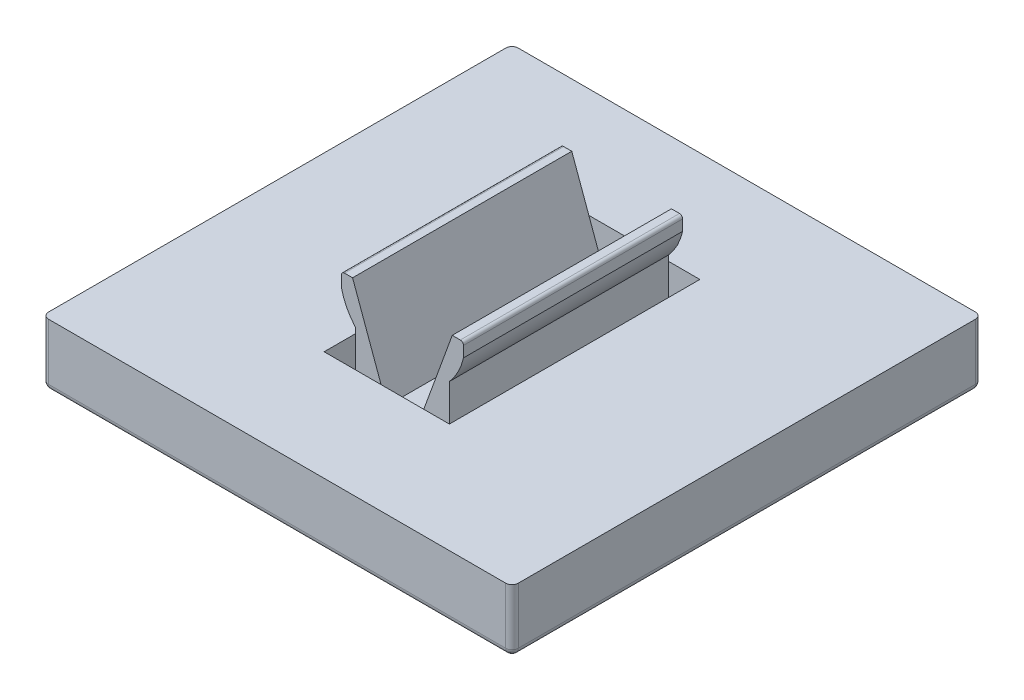
ISO-10303-21;
HEADER;
FILE_DESCRIPTION(('STEP AP214'),'2;1');
FILE_NAME('part.step','',(''),(''),'','','');
FILE_SCHEMA(('AUTOMOTIVE_DESIGN { 1 0 10303 214 1 1 1 1 }'));
ENDSEC;
DATA;
#1=APPLICATION_CONTEXT('core data for automotive mechanical design processes');
#2=APPLICATION_PROTOCOL_DEFINITION('international standard','automotive_design',2000,#1);
#3=PRODUCT_CONTEXT('',#1,'mechanical');
#4=PRODUCT('Part','Part','',(#3));
#5=PRODUCT_RELATED_PRODUCT_CATEGORY('part','',(#4));
#6=PRODUCT_DEFINITION_FORMATION('','',#4);
#7=PRODUCT_DEFINITION_CONTEXT('part definition',#1,'design');
#8=PRODUCT_DEFINITION('design','',#6,#7);
#9=PRODUCT_DEFINITION_SHAPE('','',#8);
#10=(LENGTH_UNIT() NAMED_UNIT(*) SI_UNIT(.MILLI.,.METRE.));
#11=(NAMED_UNIT(*) PLANE_ANGLE_UNIT() SI_UNIT($,.RADIAN.));
#12=(NAMED_UNIT(*) SI_UNIT($,.STERADIAN.) SOLID_ANGLE_UNIT());
#13=UNCERTAINTY_MEASURE_WITH_UNIT(LENGTH_MEASURE(1.E-05),#10,'distance_accuracy_value','');
#14=(GEOMETRIC_REPRESENTATION_CONTEXT(3) GLOBAL_UNCERTAINTY_ASSIGNED_CONTEXT((#13)) GLOBAL_UNIT_ASSIGNED_CONTEXT((#10,
#11,#12)) REPRESENTATION_CONTEXT('',''));
#15=CARTESIAN_POINT('',(0.,0.,0.));
#16=DIRECTION('',(0.,0.,1.));
#17=DIRECTION('',(1.,0.,0.));
#18=AXIS2_PLACEMENT_3D('',#15,#16,#17);
#19=CARTESIAN_POINT('',(0.,1.,0.));
#20=DIRECTION('',(0.,1.,0.));
#21=DIRECTION('',(0.,0.,1.));
#22=AXIS2_PLACEMENT_3D('',#19,#20,#21);
#23=PLANE('',#22);
#24=DIRECTION('',(1.,0.,0.));
#25=VECTOR('',#24,1.);
#26=CARTESIAN_POINT('',(0.5,1.,-3.5));
#27=LINE('',#26,#25);
#28=CARTESIAN_POINT('',(0.5,1.,-3.5));
#29=VERTEX_POINT('',#28);
#30=CARTESIAN_POINT('',(1.5,1.,-3.5));
#31=VERTEX_POINT('',#30);
#32=EDGE_CURVE('E264',#29,#31,#27,.T.);
#33=ORIENTED_EDGE('',*,*,#32,.T.);
#34=DIRECTION('',(0.,0.,1.));
#35=VECTOR('',#34,1.);
#36=CARTESIAN_POINT('',(1.5,1.,-3.5));
#37=LINE('',#36,#35);
#38=CARTESIAN_POINT('',(1.5,1.,3.5));
#39=VERTEX_POINT('',#38);
#40=EDGE_CURVE('E272',#31,#39,#37,.T.);
#41=ORIENTED_EDGE('',*,*,#40,.T.);
#42=DIRECTION('',(1.,0.,0.));
#43=VECTOR('',#42,1.);
#44=CARTESIAN_POINT('',(0.5,1.,3.5));
#45=LINE('',#44,#43);
#46=CARTESIAN_POINT('',(0.5,1.,3.5));
#47=VERTEX_POINT('',#46);
#48=EDGE_CURVE('E253',#47,#39,#45,.T.);
#49=ORIENTED_EDGE('',*,*,#48,.F.);
#50=DIRECTION('',(0.,0.,1.));
#51=VECTOR('',#50,1.);
#52=CARTESIAN_POINT('',(0.5,1.,-3.5));
#53=LINE('',#52,#51);
#54=EDGE_CURVE('E275',#29,#47,#53,.T.);
#55=ORIENTED_EDGE('',*,*,#54,.F.);
#56=EDGE_LOOP('',(#33,#41,#49,#55));
#57=FACE_BOUND('',#56,.T.);
#58=DIRECTION('',(-1.,0.,0.));
#59=VECTOR('',#58,1.);
#60=CARTESIAN_POINT('',(2.,1.,-4.));
#61=LINE('',#60,#59);
#62=CARTESIAN_POINT('',(2.,1.,-4.));
#63=VERTEX_POINT('',#62);
#64=CARTESIAN_POINT('',(-2.,1.,-4.));
#65=VERTEX_POINT('',#64);
#66=EDGE_CURVE('E325',#63,#65,#61,.T.);
#67=ORIENTED_EDGE('',*,*,#66,.T.);
#68=DIRECTION('',(0.,0.,1.));
#69=VECTOR('',#68,1.);
#70=CARTESIAN_POINT('',(-2.,1.,-4.));
#71=LINE('',#70,#69);
#72=CARTESIAN_POINT('',(-2.,1.,4.));
#73=VERTEX_POINT('',#72);
#74=EDGE_CURVE('E328',#65,#73,#71,.T.);
#75=ORIENTED_EDGE('',*,*,#74,.T.);
#76=DIRECTION('',(1.,0.,0.));
#77=VECTOR('',#76,1.);
#78=CARTESIAN_POINT('',(2.,1.,4.));
#79=LINE('',#78,#77);
#80=CARTESIAN_POINT('',(2.,1.,4.));
#81=VERTEX_POINT('',#80);
#82=EDGE_CURVE('E332',#73,#81,#79,.T.);
#83=ORIENTED_EDGE('',*,*,#82,.T.);
#84=DIRECTION('',(0.,0.,-1.));
#85=VECTOR('',#84,1.);
#86=CARTESIAN_POINT('',(2.,1.,-4.));
#87=LINE('',#86,#85);
#88=EDGE_CURVE('E335',#81,#63,#87,.T.);
#89=ORIENTED_EDGE('',*,*,#88,.T.);
#90=EDGE_LOOP('',(#67,#75,#83,#89));
#91=FACE_BOUND('',#90,.T.);
#92=DIRECTION('',(0.,0.,1.));
#93=VECTOR('',#92,1.);
#94=CARTESIAN_POINT('',(-1.5,1.,-3.5));
#95=LINE('',#94,#93);
#96=CARTESIAN_POINT('',(-1.5,1.,-3.5));
#97=VERTEX_POINT('',#96);
#98=CARTESIAN_POINT('',(-1.5,1.,3.5));
#99=VERTEX_POINT('',#98);
#100=EDGE_CURVE('E318',#97,#99,#95,.T.);
#101=ORIENTED_EDGE('',*,*,#100,.F.);
#102=DIRECTION('',(1.,0.,0.));
#103=VECTOR('',#102,1.);
#104=CARTESIAN_POINT('',(-0.5,1.,-3.5));
#105=LINE('',#104,#103);
#106=CARTESIAN_POINT('',(-0.5,1.,-3.5));
#107=VERTEX_POINT('',#106);
#108=EDGE_CURVE('E307',#97,#107,#105,.T.);
#109=ORIENTED_EDGE('',*,*,#108,.T.);
#110=DIRECTION('',(0.,0.,1.));
#111=VECTOR('',#110,1.);
#112=CARTESIAN_POINT('',(-0.5,1.,-3.5));
#113=LINE('',#112,#111);
#114=CARTESIAN_POINT('',(-0.5,1.,3.5));
#115=VERTEX_POINT('',#114);
#116=EDGE_CURVE('E316',#107,#115,#113,.T.);
#117=ORIENTED_EDGE('',*,*,#116,.T.);
#118=DIRECTION('',(1.,0.,0.));
#119=VECTOR('',#118,1.);
#120=CARTESIAN_POINT('',(-0.5,1.,3.5));
#121=LINE('',#120,#119);
#122=EDGE_CURVE('E290',#99,#115,#121,.T.);
#123=ORIENTED_EDGE('',*,*,#122,.F.);
#124=EDGE_LOOP('',(#101,#109,#117,#123));
#125=FACE_BOUND('',#124,.T.);
#126=ADVANCED_FACE('F34',(#57,#91,#125),#23,.T.);
#127=CARTESIAN_POINT('',(7.5,2.,-7.49999999999999));
#128=DIRECTION('',(0.,0.,1.));
#129=DIRECTION('',(1.,0.,0.));
#130=AXIS2_PLACEMENT_3D('',#127,#128,#129);
#131=PLANE('',#130);
#132=DIRECTION('',(-1.,0.,0.));
#133=VECTOR('',#132,1.);
#134=CARTESIAN_POINT('',(7.5,0.2,-7.49999999999999));
#135=LINE('',#134,#133);
#136=CARTESIAN_POINT('',(7.3,0.2,-7.49999999999999));
#137=VERTEX_POINT('',#136);
#138=CARTESIAN_POINT('',(-7.3,0.2,-7.49999999999999));
#139=VERTEX_POINT('',#138);
#140=EDGE_CURVE('E51',#137,#139,#135,.T.);
#141=ORIENTED_EDGE('',*,*,#140,.T.);
#142=DIRECTION('',(0.,-1.,0.));
#143=VECTOR('',#142,1.);
#144=CARTESIAN_POINT('',(-7.3,2.,-7.49999999999999));
#145=LINE('',#144,#143);
#146=CARTESIAN_POINT('',(-7.3,2.,-7.49999999999999));
#147=VERTEX_POINT('',#146);
#148=EDGE_CURVE('E414',#139,#147,#145,.F.);
#149=ORIENTED_EDGE('',*,*,#148,.T.);
#150=DIRECTION('',(-1.,0.,0.));
#151=VECTOR('',#150,1.);
#152=CARTESIAN_POINT('',(7.5,2.,-7.49999999999999));
#153=LINE('',#152,#151);
#154=CARTESIAN_POINT('',(7.3,2.,-7.49999999999999));
#155=VERTEX_POINT('',#154);
#156=EDGE_CURVE('E350',#155,#147,#153,.T.);
#157=ORIENTED_EDGE('',*,*,#156,.F.);
#158=DIRECTION('',(0.,-1.,0.));
#159=VECTOR('',#158,1.);
#160=CARTESIAN_POINT('',(7.3,2.,-7.49999999999999));
#161=LINE('',#160,#159);
#162=EDGE_CURVE('E56',#155,#137,#161,.T.);
#163=ORIENTED_EDGE('',*,*,#162,.T.);
#164=EDGE_LOOP('',(#141,#149,#157,#163));
#165=FACE_BOUND('',#164,.T.);
#166=ADVANCED_FACE('F483',(#165),#131,.F.);
#167=CARTESIAN_POINT('',(-7.5,2.,-7.49999999999999));
#168=DIRECTION('',(1.,0.,0.));
#169=DIRECTION('',(0.,0.,-1.));
#170=AXIS2_PLACEMENT_3D('',#167,#168,#169);
#171=PLANE('',#170);
#172=DIRECTION('',(0.,0.,1.));
#173=VECTOR('',#172,1.);
#174=CARTESIAN_POINT('',(-7.5,0.2,-7.49999999999999));
#175=LINE('',#174,#173);
#176=CARTESIAN_POINT('',(-7.5,0.2,-7.29999999999999));
#177=VERTEX_POINT('',#176);
#178=CARTESIAN_POINT('',(-7.5,0.2,7.30000000000001));
#179=VERTEX_POINT('',#178);
#180=EDGE_CURVE('E386',#177,#179,#175,.T.);
#181=ORIENTED_EDGE('',*,*,#180,.T.);
#182=DIRECTION('',(0.,-1.,0.));
#183=VECTOR('',#182,1.);
#184=CARTESIAN_POINT('',(-7.5,2.,7.30000000000001));
#185=LINE('',#184,#183);
#186=CARTESIAN_POINT('',(-7.5,2.,7.30000000000001));
#187=VERTEX_POINT('',#186);
#188=EDGE_CURVE('E389',#179,#187,#185,.F.);
#189=ORIENTED_EDGE('',*,*,#188,.T.);
#190=DIRECTION('',(0.,0.,1.));
#191=VECTOR('',#190,1.);
#192=CARTESIAN_POINT('',(-7.5,2.,-7.49999999999999));
#193=LINE('',#192,#191);
#194=CARTESIAN_POINT('',(-7.5,2.,-7.29999999999999));
#195=VERTEX_POINT('',#194);
#196=EDGE_CURVE('E359',#195,#187,#193,.T.);
#197=ORIENTED_EDGE('',*,*,#196,.F.);
#198=DIRECTION('',(0.,-1.,0.));
#199=VECTOR('',#198,1.);
#200=CARTESIAN_POINT('',(-7.5,2.,-7.29999999999999));
#201=LINE('',#200,#199);
#202=EDGE_CURVE('E384',#195,#177,#201,.T.);
#203=ORIENTED_EDGE('',*,*,#202,.T.);
#204=EDGE_LOOP('',(#181,#189,#197,#203));
#205=FACE_BOUND('',#204,.T.);
#206=ADVANCED_FACE('F510',(#205),#171,.F.);
#207=CARTESIAN_POINT('',(7.5,2.,7.50000000000001));
#208=DIRECTION('',(0.,0.,-1.));
#209=DIRECTION('',(-1.,0.,0.));
#210=AXIS2_PLACEMENT_3D('',#207,#208,#209);
#211=PLANE('',#210);
#212=DIRECTION('',(1.,0.,0.));
#213=VECTOR('',#212,1.);
#214=CARTESIAN_POINT('',(7.5,2.,7.50000000000001));
#215=LINE('',#214,#213);
#216=CARTESIAN_POINT('',(-7.3,2.,7.50000000000001));
#217=VERTEX_POINT('',#216);
#218=CARTESIAN_POINT('',(7.3,2.,7.50000000000001));
#219=VERTEX_POINT('',#218);
#220=EDGE_CURVE('E362',#217,#219,#215,.T.);
#221=ORIENTED_EDGE('',*,*,#220,.F.);
#222=DIRECTION('',(0.,-1.,0.));
#223=VECTOR('',#222,1.);
#224=CARTESIAN_POINT('',(-7.3,2.,7.50000000000001));
#225=LINE('',#224,#223);
#226=CARTESIAN_POINT('',(-7.3,0.2,7.50000000000001));
#227=VERTEX_POINT('',#226);
#228=EDGE_CURVE('E404',#217,#227,#225,.T.);
#229=ORIENTED_EDGE('',*,*,#228,.T.);
#230=DIRECTION('',(1.,0.,0.));
#231=VECTOR('',#230,1.);
#232=CARTESIAN_POINT('',(7.5,0.2,7.50000000000001));
#233=LINE('',#232,#231);
#234=CARTESIAN_POINT('',(7.3,0.2,7.50000000000001));
#235=VERTEX_POINT('',#234);
#236=EDGE_CURVE('E402',#227,#235,#233,.T.);
#237=ORIENTED_EDGE('',*,*,#236,.T.);
#238=DIRECTION('',(0.,-1.,0.));
#239=VECTOR('',#238,1.);
#240=CARTESIAN_POINT('',(7.3,2.,7.50000000000001));
#241=LINE('',#240,#239);
#242=EDGE_CURVE('E400',#235,#219,#241,.F.);
#243=ORIENTED_EDGE('',*,*,#242,.T.);
#244=EDGE_LOOP('',(#221,#229,#237,#243));
#245=FACE_BOUND('',#244,.T.);
#246=ADVANCED_FACE('F513',(#245),#211,.F.);
#247=CARTESIAN_POINT('',(7.5,2.,-7.49999999999999));
#248=DIRECTION('',(-1.,0.,0.));
#249=DIRECTION('',(0.,0.,1.));
#250=AXIS2_PLACEMENT_3D('',#247,#248,#249);
#251=PLANE('',#250);
#252=DIRECTION('',(0.,0.,-1.));
#253=VECTOR('',#252,1.);
#254=CARTESIAN_POINT('',(7.5,0.2,-7.49999999999999));
#255=LINE('',#254,#253);
#256=CARTESIAN_POINT('',(7.5,0.2,7.30000000000001));
#257=VERTEX_POINT('',#256);
#258=CARTESIAN_POINT('',(7.5,0.2,-7.29999999999999));
#259=VERTEX_POINT('',#258);
#260=EDGE_CURVE('E408',#257,#259,#255,.T.);
#261=ORIENTED_EDGE('',*,*,#260,.T.);
#262=DIRECTION('',(0.,-1.,0.));
#263=VECTOR('',#262,1.);
#264=CARTESIAN_POINT('',(7.5,2.,-7.29999999999999));
#265=LINE('',#264,#263);
#266=CARTESIAN_POINT('',(7.5,2.,-7.29999999999999));
#267=VERTEX_POINT('',#266);
#268=EDGE_CURVE('E410',#259,#267,#265,.F.);
#269=ORIENTED_EDGE('',*,*,#268,.T.);
#270=DIRECTION('',(0.,0.,-1.));
#271=VECTOR('',#270,1.);
#272=CARTESIAN_POINT('',(7.5,2.,-7.49999999999999));
#273=LINE('',#272,#271);
#274=CARTESIAN_POINT('',(7.5,2.,7.30000000000001));
#275=VERTEX_POINT('',#274);
#276=EDGE_CURVE('E365',#275,#267,#273,.T.);
#277=ORIENTED_EDGE('',*,*,#276,.F.);
#278=DIRECTION('',(0.,-1.,0.));
#279=VECTOR('',#278,1.);
#280=CARTESIAN_POINT('',(7.5,2.,7.30000000000001));
#281=LINE('',#280,#279);
#282=EDGE_CURVE('E406',#275,#257,#281,.T.);
#283=ORIENTED_EDGE('',*,*,#282,.T.);
#284=EDGE_LOOP('',(#261,#269,#277,#283));
#285=FACE_BOUND('',#284,.T.);
#286=ADVANCED_FACE('F489',(#285),#251,.F.);
#287=CARTESIAN_POINT('',(0.,2.,0.));
#288=DIRECTION('',(0.,1.,0.));
#289=DIRECTION('',(0.,0.,1.));
#290=AXIS2_PLACEMENT_3D('',#287,#288,#289);
#291=PLANE('',#290);
#292=DIRECTION('',(-1.,0.,0.));
#293=VECTOR('',#292,1.);
#294=CARTESIAN_POINT('',(2.,2.,-4.));
#295=LINE('',#294,#293);
#296=CARTESIAN_POINT('',(2.,2.,-4.));
#297=VERTEX_POINT('',#296);
#298=CARTESIAN_POINT('',(-2.,2.,-4.));
#299=VERTEX_POINT('',#298);
#300=EDGE_CURVE('E315',#297,#299,#295,.T.);
#301=ORIENTED_EDGE('',*,*,#300,.F.);
#302=DIRECTION('',(0.,0.,-1.));
#303=VECTOR('',#302,1.);
#304=CARTESIAN_POINT('',(2.,2.,-4.));
#305=LINE('',#304,#303);
#306=CARTESIAN_POINT('',(2.,2.,4.));
#307=VERTEX_POINT('',#306);
#308=EDGE_CURVE('E329',#307,#297,#305,.T.);
#309=ORIENTED_EDGE('',*,*,#308,.F.);
#310=DIRECTION('',(1.,0.,0.));
#311=VECTOR('',#310,1.);
#312=CARTESIAN_POINT('',(2.,2.,4.));
#313=LINE('',#312,#311);
#314=CARTESIAN_POINT('',(-2.,2.,4.));
#315=VERTEX_POINT('',#314);
#316=EDGE_CURVE('E343',#315,#307,#313,.T.);
#317=ORIENTED_EDGE('',*,*,#316,.F.);
#318=DIRECTION('',(0.,0.,1.));
#319=VECTOR('',#318,1.);
#320=CARTESIAN_POINT('',(-2.,2.,-4.));
#321=LINE('',#320,#319);
#322=EDGE_CURVE('E340',#299,#315,#321,.T.);
#323=ORIENTED_EDGE('',*,*,#322,.F.);
#324=EDGE_LOOP('',(#301,#309,#317,#323));
#325=FACE_BOUND('',#324,.T.);
#326=ORIENTED_EDGE('',*,*,#196,.T.);
#327=CARTESIAN_POINT('',(-7.3,2.,7.30000000000001));
#328=DIRECTION('',(0.,1.,0.));
#329=DIRECTION('',(0.,0.,1.));
#330=AXIS2_PLACEMENT_3D('',#327,#328,#329);
#331=CIRCLE('',#330,0.2);
#332=EDGE_CURVE('E11',#187,#217,#331,.T.);
#333=ORIENTED_EDGE('',*,*,#332,.T.);
#334=ORIENTED_EDGE('',*,*,#220,.T.);
#335=CARTESIAN_POINT('',(7.3,2.,7.30000000000001));
#336=DIRECTION('',(0.,1.,0.));
#337=DIRECTION('',(0.,0.,1.));
#338=AXIS2_PLACEMENT_3D('',#335,#336,#337);
#339=CIRCLE('',#338,0.2);
#340=EDGE_CURVE('E416',#219,#275,#339,.T.);
#341=ORIENTED_EDGE('',*,*,#340,.T.);
#342=ORIENTED_EDGE('',*,*,#276,.T.);
#343=CARTESIAN_POINT('',(7.3,2.,-7.29999999999999));
#344=DIRECTION('',(0.,1.,0.));
#345=DIRECTION('',(0.,0.,1.));
#346=AXIS2_PLACEMENT_3D('',#343,#344,#345);
#347=CIRCLE('',#346,0.2);
#348=EDGE_CURVE('E418',#267,#155,#347,.T.);
#349=ORIENTED_EDGE('',*,*,#348,.T.);
#350=ORIENTED_EDGE('',*,*,#156,.T.);
#351=CARTESIAN_POINT('',(-7.3,2.,-7.29999999999999));
#352=DIRECTION('',(0.,1.,0.));
#353=DIRECTION('',(0.,0.,1.));
#354=AXIS2_PLACEMENT_3D('',#351,#352,#353);
#355=CIRCLE('',#354,0.2);
#356=EDGE_CURVE('E43',#147,#195,#355,.T.);
#357=ORIENTED_EDGE('',*,*,#356,.T.);
#358=EDGE_LOOP('',(#326,#333,#334,#341,#342,#349,#350,#357));
#359=FACE_BOUND('',#358,.T.);
#360=ADVANCED_FACE('F485',(#325,#359),#291,.T.);
#361=CARTESIAN_POINT('',(0.,0.,0.));
#362=DIRECTION('',(0.,1.,0.));
#363=DIRECTION('',(0.,0.,1.));
#364=AXIS2_PLACEMENT_3D('',#361,#362,#363);
#365=PLANE('',#364);
#366=DIRECTION('',(1.,0.,0.));
#367=VECTOR('',#366,1.);
#368=CARTESIAN_POINT('',(0.,0.,7.30000000000001));
#369=LINE('',#368,#367);
#370=CARTESIAN_POINT('',(7.3,0.,7.30000000000001));
#371=VERTEX_POINT('',#370);
#372=CARTESIAN_POINT('',(-7.3,0.,7.30000000000001));
#373=VERTEX_POINT('',#372);
#374=EDGE_CURVE('E395',#371,#373,#369,.F.);
#375=ORIENTED_EDGE('',*,*,#374,.T.);
#376=DIRECTION('',(0.,0.,1.));
#377=VECTOR('',#376,1.);
#378=CARTESIAN_POINT('',(-7.3,0.,0.));
#379=LINE('',#378,#377);
#380=CARTESIAN_POINT('',(-7.3,0.,-7.29999999999999));
#381=VERTEX_POINT('',#380);
#382=EDGE_CURVE('E397',#373,#381,#379,.F.);
#383=ORIENTED_EDGE('',*,*,#382,.T.);
#384=DIRECTION('',(-1.,0.,0.));
#385=VECTOR('',#384,1.);
#386=CARTESIAN_POINT('',(0.,0.,-7.29999999999999));
#387=LINE('',#386,#385);
#388=CARTESIAN_POINT('',(7.3,0.,-7.29999999999999));
#389=VERTEX_POINT('',#388);
#390=EDGE_CURVE('E391',#381,#389,#387,.F.);
#391=ORIENTED_EDGE('',*,*,#390,.T.);
#392=DIRECTION('',(0.,0.,-1.));
#393=VECTOR('',#392,1.);
#394=CARTESIAN_POINT('',(7.3,0.,0.));
#395=LINE('',#394,#393);
#396=EDGE_CURVE('E393',#389,#371,#395,.F.);
#397=ORIENTED_EDGE('',*,*,#396,.T.);
#398=EDGE_LOOP('',(#375,#383,#391,#397));
#399=FACE_BOUND('',#398,.T.);
#400=ADVANCED_FACE('F466',(#399),#365,.F.);
#401=CARTESIAN_POINT('',(2.,1.,-4.));
#402=DIRECTION('',(0.,0.,-1.));
#403=DIRECTION('',(-1.,0.,0.));
#404=AXIS2_PLACEMENT_3D('',#401,#402,#403);
#405=PLANE('',#404);
#406=ORIENTED_EDGE('',*,*,#300,.T.);
#407=DIRECTION('',(0.,1.,0.));
#408=VECTOR('',#407,1.);
#409=CARTESIAN_POINT('',(-2.,1.,-4.));
#410=LINE('',#409,#408);
#411=EDGE_CURVE('E338',#65,#299,#410,.T.);
#412=ORIENTED_EDGE('',*,*,#411,.F.);
#413=ORIENTED_EDGE('',*,*,#66,.F.);
#414=DIRECTION('',(0.,1.,0.));
#415=VECTOR('',#414,1.);
#416=CARTESIAN_POINT('',(2.,1.,-4.));
#417=LINE('',#416,#415);
#418=EDGE_CURVE('E348',#63,#297,#417,.T.);
#419=ORIENTED_EDGE('',*,*,#418,.T.);
#420=EDGE_LOOP('',(#406,#412,#413,#419));
#421=FACE_BOUND('',#420,.T.);
#422=ADVANCED_FACE('F538',(#421),#405,.F.);
#423=CARTESIAN_POINT('',(2.,1.,-4.));
#424=DIRECTION('',(1.,0.,0.));
#425=DIRECTION('',(0.,0.,-1.));
#426=AXIS2_PLACEMENT_3D('',#423,#424,#425);
#427=PLANE('',#426);
#428=ORIENTED_EDGE('',*,*,#308,.T.);
#429=ORIENTED_EDGE('',*,*,#418,.F.);
#430=ORIENTED_EDGE('',*,*,#88,.F.);
#431=DIRECTION('',(0.,1.,0.));
#432=VECTOR('',#431,1.);
#433=CARTESIAN_POINT('',(2.,1.,4.));
#434=LINE('',#433,#432);
#435=EDGE_CURVE('E351',#81,#307,#434,.T.);
#436=ORIENTED_EDGE('',*,*,#435,.T.);
#437=EDGE_LOOP('',(#428,#429,#430,#436));
#438=FACE_BOUND('',#437,.T.);
#439=ADVANCED_FACE('F534',(#438),#427,.F.);
#440=CARTESIAN_POINT('',(2.,1.,4.));
#441=DIRECTION('',(0.,0.,1.));
#442=DIRECTION('',(1.,0.,0.));
#443=AXIS2_PLACEMENT_3D('',#440,#441,#442);
#444=PLANE('',#443);
#445=ORIENTED_EDGE('',*,*,#316,.T.);
#446=ORIENTED_EDGE('',*,*,#435,.F.);
#447=ORIENTED_EDGE('',*,*,#82,.F.);
#448=DIRECTION('',(0.,1.,0.));
#449=VECTOR('',#448,1.);
#450=CARTESIAN_POINT('',(-2.,1.,4.));
#451=LINE('',#450,#449);
#452=EDGE_CURVE('E353',#73,#315,#451,.T.);
#453=ORIENTED_EDGE('',*,*,#452,.T.);
#454=EDGE_LOOP('',(#445,#446,#447,#453));
#455=FACE_BOUND('',#454,.T.);
#456=ADVANCED_FACE('F537',(#455),#444,.F.);
#457=CARTESIAN_POINT('',(-2.,1.,-4.));
#458=DIRECTION('',(-1.,0.,0.));
#459=DIRECTION('',(0.,0.,1.));
#460=AXIS2_PLACEMENT_3D('',#457,#458,#459);
#461=PLANE('',#460);
#462=ORIENTED_EDGE('',*,*,#322,.T.);
#463=ORIENTED_EDGE('',*,*,#452,.F.);
#464=ORIENTED_EDGE('',*,*,#74,.F.);
#465=ORIENTED_EDGE('',*,*,#411,.T.);
#466=EDGE_LOOP('',(#462,#463,#464,#465));
#467=FACE_BOUND('',#466,.T.);
#468=ADVANCED_FACE('F542',(#467),#461,.F.);
#469=CARTESIAN_POINT('',(-1.59191070279861,4.,-3.5));
#470=DIRECTION('',(0.,1.,0.));
#471=DIRECTION('',(0.,0.,1.));
#472=AXIS2_PLACEMENT_3D('',#469,#470,#471);
#473=PLANE('',#472);
#474=DIRECTION('',(-1.,0.,0.));
#475=VECTOR('',#474,1.);
#476=CARTESIAN_POINT('',(-1.59191070279861,4.,-3.5));
#477=LINE('',#476,#475);
#478=CARTESIAN_POINT('',(-1.59191070279861,4.,-3.5));
#479=VERTEX_POINT('',#478);
#480=CARTESIAN_POINT('',(-1.85,4.,-3.5));
#481=VERTEX_POINT('',#480);
#482=EDGE_CURVE('E296',#479,#481,#477,.T.);
#483=ORIENTED_EDGE('',*,*,#482,.T.);
#484=DIRECTION('',(0.,0.,1.));
#485=VECTOR('',#484,1.);
#486=CARTESIAN_POINT('',(-1.85,4.,-3.5));
#487=LINE('',#486,#485);
#488=CARTESIAN_POINT('',(-1.85,4.,3.5));
#489=VERTEX_POINT('',#488);
#490=EDGE_CURVE('E375',#481,#489,#487,.T.);
#491=ORIENTED_EDGE('',*,*,#490,.T.);
#492=DIRECTION('',(-1.,0.,0.));
#493=VECTOR('',#492,1.);
#494=CARTESIAN_POINT('',(-1.59191070279861,4.,3.5));
#495=LINE('',#494,#493);
#496=CARTESIAN_POINT('',(-1.59191070279861,4.,3.5));
#497=VERTEX_POINT('',#496);
#498=EDGE_CURVE('E271',#497,#489,#495,.T.);
#499=ORIENTED_EDGE('',*,*,#498,.F.);
#500=DIRECTION('',(0.,0.,1.));
#501=VECTOR('',#500,1.);
#502=CARTESIAN_POINT('',(-1.59191070279861,4.,-3.5));
#503=LINE('',#502,#501);
#504=EDGE_CURVE('E313',#479,#497,#503,.T.);
#505=ORIENTED_EDGE('',*,*,#504,.F.);
#506=EDGE_LOOP('',(#483,#491,#499,#505));
#507=FACE_BOUND('',#506,.T.);
#508=ADVANCED_FACE('F532',(#507),#473,.T.);
#509=CARTESIAN_POINT('',(-0.5,1.,-3.5));
#510=DIRECTION('',(0.939692620785908,0.342020143325669,0.));
#511=DIRECTION('',(-0.342020143325669,0.939692620785908,0.));
#512=AXIS2_PLACEMENT_3D('',#509,#510,#511);
#513=PLANE('',#512);
#514=ORIENTED_EDGE('',*,*,#504,.T.);
#515=DIRECTION('',(-0.342020143325669,0.939692620785908,0.));
#516=VECTOR('',#515,1.);
#517=CARTESIAN_POINT('',(-0.5,1.,3.5));
#518=LINE('',#517,#516);
#519=EDGE_CURVE('E293',#115,#497,#518,.T.);
#520=ORIENTED_EDGE('',*,*,#519,.F.);
#521=ORIENTED_EDGE('',*,*,#116,.F.);
#522=DIRECTION('',(-0.342020143325669,0.939692620785908,0.));
#523=VECTOR('',#522,1.);
#524=CARTESIAN_POINT('',(-0.5,1.,-3.5));
#525=LINE('',#524,#523);
#526=EDGE_CURVE('E309',#107,#479,#525,.T.);
#527=ORIENTED_EDGE('',*,*,#526,.T.);
#528=EDGE_LOOP('',(#514,#520,#521,#527));
#529=FACE_BOUND('',#528,.T.);
#530=ADVANCED_FACE('F581',(#529),#513,.T.);
#531=CARTESIAN_POINT('',(-1.5,1.,-3.5));
#532=DIRECTION('',(-1.,0.,0.));
#533=DIRECTION('',(0.,-1.,0.));
#534=AXIS2_PLACEMENT_3D('',#531,#532,#533);
#535=PLANE('',#534);
#536=ORIENTED_EDGE('',*,*,#100,.T.);
#537=DIRECTION('',(0.,-1.,0.));
#538=VECTOR('',#537,1.);
#539=CARTESIAN_POINT('',(-1.5,1.,3.5));
#540=LINE('',#539,#538);
#541=CARTESIAN_POINT('',(-1.5,2.6771243444677,3.5));
#542=VERTEX_POINT('',#541);
#543=EDGE_CURVE('E287',#542,#99,#540,.T.);
#544=ORIENTED_EDGE('',*,*,#543,.F.);
#545=DIRECTION('',(0.,0.,1.));
#546=VECTOR('',#545,1.);
#547=CARTESIAN_POINT('',(-1.5,2.6771243444677,-3.5));
#548=LINE('',#547,#546);
#549=CARTESIAN_POINT('',(-1.5,2.6771243444677,-3.5));
#550=VERTEX_POINT('',#549);
#551=EDGE_CURVE('E321',#550,#542,#548,.T.);
#552=ORIENTED_EDGE('',*,*,#551,.F.);
#553=DIRECTION('',(0.,-1.,0.));
#554=VECTOR('',#553,1.);
#555=CARTESIAN_POINT('',(-1.5,1.,-3.5));
#556=LINE('',#555,#554);
#557=EDGE_CURVE('E304',#550,#97,#556,.T.);
#558=ORIENTED_EDGE('',*,*,#557,.T.);
#559=EDGE_LOOP('',(#536,#544,#552,#558));
#560=FACE_BOUND('',#559,.T.);
#561=ADVANCED_FACE('F590',(#560),#535,.T.);
#562=CARTESIAN_POINT('',(0.,4.,-3.5));
#563=DIRECTION('',(0.,0.,1.));
#564=DIRECTION('',(1.,0.,0.));
#565=AXIS2_PLACEMENT_3D('',#562,#563,#564);
#566=CYLINDRICAL_SURFACE('',#565,2.);
#567=ORIENTED_EDGE('',*,*,#551,.T.);
#568=CARTESIAN_POINT('',(0.,4.,3.5));
#569=DIRECTION('',(0.,0.,1.));
#570=DIRECTION('',(1.,0.,0.));
#571=AXIS2_PLACEMENT_3D('',#568,#569,#570);
#572=CIRCLE('',#571,2.);
#573=CARTESIAN_POINT('',(-1.95,3.55559027913422,3.5));
#574=VERTEX_POINT('',#573);
#575=EDGE_CURVE('E284',#574,#542,#572,.T.);
#576=ORIENTED_EDGE('',*,*,#575,.F.);
#577=DIRECTION('',(0.,0.,1.));
#578=VECTOR('',#577,1.);
#579=CARTESIAN_POINT('',(-1.95,3.55559027913422,-3.5));
#580=LINE('',#579,#578);
#581=CARTESIAN_POINT('',(-1.95,3.55559027913422,-3.5));
#582=VERTEX_POINT('',#581);
#583=EDGE_CURVE('E312',#582,#574,#580,.T.);
#584=ORIENTED_EDGE('',*,*,#583,.F.);
#585=CARTESIAN_POINT('',(0.,4.,-3.5));
#586=DIRECTION('',(0.,0.,1.));
#587=DIRECTION('',(1.,0.,0.));
#588=AXIS2_PLACEMENT_3D('',#585,#586,#587);
#589=CIRCLE('',#588,2.);
#590=EDGE_CURVE('E301',#582,#550,#589,.T.);
#591=ORIENTED_EDGE('',*,*,#590,.T.);
#592=EDGE_LOOP('',(#567,#576,#584,#591));
#593=FACE_BOUND('',#592,.T.);
#594=ADVANCED_FACE('F598',(#593),#566,.T.);
#595=CARTESIAN_POINT('',(-1.95,4.,-3.5));
#596=DIRECTION('',(-1.,0.,0.));
#597=DIRECTION('',(0.,0.,1.));
#598=AXIS2_PLACEMENT_3D('',#595,#596,#597);
#599=PLANE('',#598);
#600=DIRECTION('',(0.,-1.,0.));
#601=VECTOR('',#600,1.);
#602=CARTESIAN_POINT('',(-1.95,4.,3.5));
#603=LINE('',#602,#601);
#604=CARTESIAN_POINT('',(-1.95,3.9,3.5));
#605=VERTEX_POINT('',#604);
#606=EDGE_CURVE('E282',#605,#574,#603,.T.);
#607=ORIENTED_EDGE('',*,*,#606,.F.);
#608=DIRECTION('',(0.,0.,1.));
#609=VECTOR('',#608,1.);
#610=CARTESIAN_POINT('',(-1.95,3.9,-3.5));
#611=LINE('',#610,#609);
#612=CARTESIAN_POINT('',(-1.95,3.9,-3.5));
#613=VERTEX_POINT('',#612);
#614=EDGE_CURVE('E380',#605,#613,#611,.F.);
#615=ORIENTED_EDGE('',*,*,#614,.T.);
#616=DIRECTION('',(0.,-1.,0.));
#617=VECTOR('',#616,1.);
#618=CARTESIAN_POINT('',(-1.95,4.,-3.5));
#619=LINE('',#618,#617);
#620=EDGE_CURVE('E299',#613,#582,#619,.T.);
#621=ORIENTED_EDGE('',*,*,#620,.T.);
#622=ORIENTED_EDGE('',*,*,#583,.T.);
#623=EDGE_LOOP('',(#607,#615,#621,#622));
#624=FACE_BOUND('',#623,.T.);
#625=ADVANCED_FACE('F606',(#624),#599,.T.);
#626=CARTESIAN_POINT('',(0.,4.,-3.5));
#627=DIRECTION('',(0.,0.,1.));
#628=DIRECTION('',(1.,0.,0.));
#629=AXIS2_PLACEMENT_3D('',#626,#627,#628);
#630=PLANE('',#629);
#631=ORIENTED_EDGE('',*,*,#620,.F.);
#632=CARTESIAN_POINT('',(-1.85,3.9,-3.5));
#633=DIRECTION('',(0.,0.,1.));
#634=DIRECTION('',(1.,0.,0.));
#635=AXIS2_PLACEMENT_3D('',#632,#633,#634);
#636=CIRCLE('',#635,0.1);
#637=EDGE_CURVE('E382',#613,#481,#636,.F.);
#638=ORIENTED_EDGE('',*,*,#637,.T.);
#639=ORIENTED_EDGE('',*,*,#482,.F.);
#640=ORIENTED_EDGE('',*,*,#526,.F.);
#641=ORIENTED_EDGE('',*,*,#108,.F.);
#642=ORIENTED_EDGE('',*,*,#557,.F.);
#643=ORIENTED_EDGE('',*,*,#590,.F.);
#644=EDGE_LOOP('',(#631,#638,#639,#640,#641,#642,#643));
#645=FACE_BOUND('',#644,.T.);
#646=ADVANCED_FACE('F614',(#645),#630,.F.);
#647=CARTESIAN_POINT('',(0.,4.,3.5));
#648=DIRECTION('',(0.,0.,1.));
#649=DIRECTION('',(1.,0.,0.));
#650=AXIS2_PLACEMENT_3D('',#647,#648,#649);
#651=PLANE('',#650);
#652=ORIENTED_EDGE('',*,*,#498,.T.);
#653=CARTESIAN_POINT('',(-1.85,3.9,3.5));
#654=DIRECTION('',(0.,0.,1.));
#655=DIRECTION('',(1.,0.,0.));
#656=AXIS2_PLACEMENT_3D('',#653,#654,#655);
#657=CIRCLE('',#656,0.1);
#658=EDGE_CURVE('E378',#489,#605,#657,.T.);
#659=ORIENTED_EDGE('',*,*,#658,.T.);
#660=ORIENTED_EDGE('',*,*,#606,.T.);
#661=ORIENTED_EDGE('',*,*,#575,.T.);
#662=ORIENTED_EDGE('',*,*,#543,.T.);
#663=ORIENTED_EDGE('',*,*,#122,.T.);
#664=ORIENTED_EDGE('',*,*,#519,.T.);
#665=EDGE_LOOP('',(#652,#659,#660,#661,#662,#663,#664));
#666=FACE_BOUND('',#665,.T.);
#667=ADVANCED_FACE('F621',(#666),#651,.T.);
#668=CARTESIAN_POINT('',(0.,4.,-3.5));
#669=DIRECTION('',(0.,0.,1.));
#670=DIRECTION('',(1.,0.,0.));
#671=AXIS2_PLACEMENT_3D('',#668,#669,#670);
#672=CYLINDRICAL_SURFACE('',#671,2.);
#673=DIRECTION('',(0.,0.,1.));
#674=VECTOR('',#673,1.);
#675=CARTESIAN_POINT('',(1.95,3.55559027913422,-3.5));
#676=LINE('',#675,#674);
#677=CARTESIAN_POINT('',(1.95,3.55559027913422,-3.5));
#678=VERTEX_POINT('',#677);
#679=CARTESIAN_POINT('',(1.95,3.55559027913422,3.5));
#680=VERTEX_POINT('',#679);
#681=EDGE_CURVE('E220',#678,#680,#676,.T.);
#682=ORIENTED_EDGE('',*,*,#681,.T.);
#683=CARTESIAN_POINT('',(0.,4.,3.5));
#684=DIRECTION('',(0.,0.,1.));
#685=DIRECTION('',(-1.,0.,0.));
#686=AXIS2_PLACEMENT_3D('',#683,#684,#685);
#687=CIRCLE('',#686,2.);
#688=CARTESIAN_POINT('',(1.5,2.6771243444677,3.5));
#689=VERTEX_POINT('',#688);
#690=EDGE_CURVE('E224',#689,#680,#687,.T.);
#691=ORIENTED_EDGE('',*,*,#690,.F.);
#692=DIRECTION('',(0.,0.,1.));
#693=VECTOR('',#692,1.);
#694=CARTESIAN_POINT('',(1.5,2.6771243444677,-3.5));
#695=LINE('',#694,#693);
#696=CARTESIAN_POINT('',(1.5,2.6771243444677,-3.5));
#697=VERTEX_POINT('',#696);
#698=EDGE_CURVE('E269',#697,#689,#695,.T.);
#699=ORIENTED_EDGE('',*,*,#698,.F.);
#700=CARTESIAN_POINT('',(0.,4.,-3.5));
#701=DIRECTION('',(0.,0.,1.));
#702=DIRECTION('',(-1.,0.,0.));
#703=AXIS2_PLACEMENT_3D('',#700,#701,#702);
#704=CIRCLE('',#703,2.);
#705=EDGE_CURVE('E226',#697,#678,#704,.T.);
#706=ORIENTED_EDGE('',*,*,#705,.T.);
#707=EDGE_LOOP('',(#682,#691,#699,#706));
#708=FACE_BOUND('',#707,.T.);
#709=ADVANCED_FACE('F222',(#708),#672,.T.);
#710=CARTESIAN_POINT('',(1.5,1.,-3.5));
#711=DIRECTION('',(1.,0.,0.));
#712=DIRECTION('',(0.,1.,0.));
#713=AXIS2_PLACEMENT_3D('',#710,#711,#712);
#714=PLANE('',#713);
#715=ORIENTED_EDGE('',*,*,#698,.T.);
#716=DIRECTION('',(0.,1.,0.));
#717=VECTOR('',#716,1.);
#718=CARTESIAN_POINT('',(1.5,1.,3.5));
#719=LINE('',#718,#717);
#720=EDGE_CURVE('E245',#39,#689,#719,.T.);
#721=ORIENTED_EDGE('',*,*,#720,.F.);
#722=ORIENTED_EDGE('',*,*,#40,.F.);
#723=DIRECTION('',(0.,1.,0.));
#724=VECTOR('',#723,1.);
#725=CARTESIAN_POINT('',(1.5,1.,-3.5));
#726=LINE('',#725,#724);
#727=EDGE_CURVE('E231',#31,#697,#726,.T.);
#728=ORIENTED_EDGE('',*,*,#727,.T.);
#729=EDGE_LOOP('',(#715,#721,#722,#728));
#730=FACE_BOUND('',#729,.T.);
#731=ADVANCED_FACE('F636',(#730),#714,.T.);
#732=CARTESIAN_POINT('',(0.5,1.,-3.5));
#733=DIRECTION('',(-0.939692620785908,0.342020143325669,0.));
#734=DIRECTION('',(-0.342020143325669,-0.939692620785908,0.));
#735=AXIS2_PLACEMENT_3D('',#732,#733,#734);
#736=PLANE('',#735);
#737=ORIENTED_EDGE('',*,*,#54,.T.);
#738=DIRECTION('',(-0.342020143325669,-0.939692620785908,0.));
#739=VECTOR('',#738,1.);
#740=CARTESIAN_POINT('',(0.5,1.,3.5));
#741=LINE('',#740,#739);
#742=CARTESIAN_POINT('',(1.59191070279861,4.,3.5));
#743=VERTEX_POINT('',#742);
#744=EDGE_CURVE('E251',#743,#47,#741,.T.);
#745=ORIENTED_EDGE('',*,*,#744,.F.);
#746=DIRECTION('',(0.,0.,1.));
#747=VECTOR('',#746,1.);
#748=CARTESIAN_POINT('',(1.59191070279861,4.,-3.5));
#749=LINE('',#748,#747);
#750=CARTESIAN_POINT('',(1.59191070279861,4.,-3.5));
#751=VERTEX_POINT('',#750);
#752=EDGE_CURVE('E230',#751,#743,#749,.T.);
#753=ORIENTED_EDGE('',*,*,#752,.F.);
#754=DIRECTION('',(-0.342020143325669,-0.939692620785908,0.));
#755=VECTOR('',#754,1.);
#756=CARTESIAN_POINT('',(0.5,1.,-3.5));
#757=LINE('',#756,#755);
#758=EDGE_CURVE('E261',#751,#29,#757,.T.);
#759=ORIENTED_EDGE('',*,*,#758,.T.);
#760=EDGE_LOOP('',(#737,#745,#753,#759));
#761=FACE_BOUND('',#760,.T.);
#762=ADVANCED_FACE('F643',(#761),#736,.T.);
#763=CARTESIAN_POINT('',(1.59191070279861,4.,-3.5));
#764=DIRECTION('',(0.,1.,0.));
#765=DIRECTION('',(0.,0.,1.));
#766=AXIS2_PLACEMENT_3D('',#763,#764,#765);
#767=PLANE('',#766);
#768=DIRECTION('',(-1.,0.,0.));
#769=VECTOR('',#768,1.);
#770=CARTESIAN_POINT('',(1.59191070279861,4.,3.5));
#771=LINE('',#770,#769);
#772=CARTESIAN_POINT('',(1.85,4.,3.5));
#773=VERTEX_POINT('',#772);
#774=EDGE_CURVE('E240',#773,#743,#771,.T.);
#775=ORIENTED_EDGE('',*,*,#774,.F.);
#776=DIRECTION('',(0.,0.,1.));
#777=VECTOR('',#776,1.);
#778=CARTESIAN_POINT('',(1.85,4.,-3.5));
#779=LINE('',#778,#777);
#780=CARTESIAN_POINT('',(1.85,4.,-3.5));
#781=VERTEX_POINT('',#780);
#782=EDGE_CURVE('E371',#773,#781,#779,.F.);
#783=ORIENTED_EDGE('',*,*,#782,.T.);
#784=DIRECTION('',(-1.,0.,0.));
#785=VECTOR('',#784,1.);
#786=CARTESIAN_POINT('',(1.59191070279861,4.,-3.5));
#787=LINE('',#786,#785);
#788=EDGE_CURVE('E259',#781,#751,#787,.T.);
#789=ORIENTED_EDGE('',*,*,#788,.T.);
#790=ORIENTED_EDGE('',*,*,#752,.T.);
#791=EDGE_LOOP('',(#775,#783,#789,#790));
#792=FACE_BOUND('',#791,.T.);
#793=ADVANCED_FACE('F650',(#792),#767,.T.);
#794=CARTESIAN_POINT('',(1.95,4.,-3.5));
#795=DIRECTION('',(1.,0.,0.));
#796=DIRECTION('',(0.,0.,-1.));
#797=AXIS2_PLACEMENT_3D('',#794,#795,#796);
#798=PLANE('',#797);
#799=DIRECTION('',(0.,1.,0.));
#800=VECTOR('',#799,1.);
#801=CARTESIAN_POINT('',(1.95,4.,-3.5));
#802=LINE('',#801,#800);
#803=CARTESIAN_POINT('',(1.95,3.9,-3.5));
#804=VERTEX_POINT('',#803);
#805=EDGE_CURVE('E257',#678,#804,#802,.T.);
#806=ORIENTED_EDGE('',*,*,#805,.T.);
#807=DIRECTION('',(0.,0.,1.));
#808=VECTOR('',#807,1.);
#809=CARTESIAN_POINT('',(1.95,3.9,-3.5));
#810=LINE('',#809,#808);
#811=CARTESIAN_POINT('',(1.95,3.9,3.5));
#812=VERTEX_POINT('',#811);
#813=EDGE_CURVE('E238',#804,#812,#810,.T.);
#814=ORIENTED_EDGE('',*,*,#813,.T.);
#815=DIRECTION('',(0.,1.,0.));
#816=VECTOR('',#815,1.);
#817=CARTESIAN_POINT('',(1.95,4.,3.5));
#818=LINE('',#817,#816);
#819=EDGE_CURVE('E235',#680,#812,#818,.T.);
#820=ORIENTED_EDGE('',*,*,#819,.F.);
#821=ORIENTED_EDGE('',*,*,#681,.F.);
#822=EDGE_LOOP('',(#806,#814,#820,#821));
#823=FACE_BOUND('',#822,.T.);
#824=ADVANCED_FACE('F236',(#823),#798,.T.);
#825=CARTESIAN_POINT('',(0.,4.,-3.5));
#826=DIRECTION('',(0.,0.,-1.));
#827=DIRECTION('',(-1.,0.,0.));
#828=AXIS2_PLACEMENT_3D('',#825,#826,#827);
#829=PLANE('',#828);
#830=ORIENTED_EDGE('',*,*,#788,.F.);
#831=CARTESIAN_POINT('',(1.85,3.9,-3.5));
#832=DIRECTION('',(0.,0.,-1.));
#833=DIRECTION('',(-1.,0.,0.));
#834=AXIS2_PLACEMENT_3D('',#831,#832,#833);
#835=CIRCLE('',#834,0.1);
#836=EDGE_CURVE('E373',#781,#804,#835,.T.);
#837=ORIENTED_EDGE('',*,*,#836,.T.);
#838=ORIENTED_EDGE('',*,*,#805,.F.);
#839=ORIENTED_EDGE('',*,*,#705,.F.);
#840=ORIENTED_EDGE('',*,*,#727,.F.);
#841=ORIENTED_EDGE('',*,*,#32,.F.);
#842=ORIENTED_EDGE('',*,*,#758,.F.);
#843=EDGE_LOOP('',(#830,#837,#838,#839,#840,#841,#842));
#844=FACE_BOUND('',#843,.T.);
#845=ADVANCED_FACE('F664',(#844),#829,.T.);
#846=CARTESIAN_POINT('',(0.,4.,3.5));
#847=DIRECTION('',(0.,0.,-1.));
#848=DIRECTION('',(-1.,0.,0.));
#849=AXIS2_PLACEMENT_3D('',#846,#847,#848);
#850=PLANE('',#849);
#851=ORIENTED_EDGE('',*,*,#819,.T.);
#852=CARTESIAN_POINT('',(1.85,3.9,3.5));
#853=DIRECTION('',(0.,0.,-1.));
#854=DIRECTION('',(-1.,0.,0.));
#855=AXIS2_PLACEMENT_3D('',#852,#853,#854);
#856=CIRCLE('',#855,0.1);
#857=EDGE_CURVE('E369',#812,#773,#856,.F.);
#858=ORIENTED_EDGE('',*,*,#857,.T.);
#859=ORIENTED_EDGE('',*,*,#774,.T.);
#860=ORIENTED_EDGE('',*,*,#744,.T.);
#861=ORIENTED_EDGE('',*,*,#48,.T.);
#862=ORIENTED_EDGE('',*,*,#720,.T.);
#863=ORIENTED_EDGE('',*,*,#690,.T.);
#864=EDGE_LOOP('',(#851,#858,#859,#860,#861,#862,#863));
#865=FACE_BOUND('',#864,.T.);
#866=ADVANCED_FACE('F243',(#865),#850,.F.);
#867=CARTESIAN_POINT('',(1.85,3.9,-3.5));
#868=DIRECTION('',(0.,0.,1.));
#869=DIRECTION('',(1.,0.,0.));
#870=AXIS2_PLACEMENT_3D('',#867,#868,#869);
#871=CYLINDRICAL_SURFACE('',#870,0.1);
#872=ORIENTED_EDGE('',*,*,#836,.F.);
#873=ORIENTED_EDGE('',*,*,#782,.F.);
#874=ORIENTED_EDGE('',*,*,#857,.F.);
#875=ORIENTED_EDGE('',*,*,#813,.F.);
#876=EDGE_LOOP('',(#872,#873,#874,#875));
#877=FACE_BOUND('',#876,.T.);
#878=ADVANCED_FACE('F678',(#877),#871,.T.);
#879=CARTESIAN_POINT('',(-1.85,3.9,-3.5));
#880=DIRECTION('',(0.,0.,1.));
#881=DIRECTION('',(1.,0.,0.));
#882=AXIS2_PLACEMENT_3D('',#879,#880,#881);
#883=CYLINDRICAL_SURFACE('',#882,0.1);
#884=ORIENTED_EDGE('',*,*,#637,.F.);
#885=ORIENTED_EDGE('',*,*,#614,.F.);
#886=ORIENTED_EDGE('',*,*,#658,.F.);
#887=ORIENTED_EDGE('',*,*,#490,.F.);
#888=EDGE_LOOP('',(#884,#885,#886,#887));
#889=FACE_BOUND('',#888,.T.);
#890=ADVANCED_FACE('F685',(#889),#883,.T.);
#891=CARTESIAN_POINT('',(7.3,2.,-7.29999999999999));
#892=DIRECTION('',(0.,-1.,0.));
#893=DIRECTION('',(0.,0.,-1.));
#894=AXIS2_PLACEMENT_3D('',#891,#892,#893);
#895=CYLINDRICAL_SURFACE('',#894,0.2);
#896=ORIENTED_EDGE('',*,*,#348,.F.);
#897=ORIENTED_EDGE('',*,*,#268,.F.);
#898=CARTESIAN_POINT('',(7.3,0.2,-7.29999999999999));
#899=DIRECTION('',(0.,-1.,0.));
#900=DIRECTION('',(0.,0.,-1.));
#901=AXIS2_PLACEMENT_3D('',#898,#899,#900);
#902=CIRCLE('',#901,0.2);
#903=EDGE_CURVE('E248',#137,#259,#902,.T.);
#904=ORIENTED_EDGE('',*,*,#903,.F.);
#905=ORIENTED_EDGE('',*,*,#162,.F.);
#906=EDGE_LOOP('',(#896,#897,#904,#905));
#907=FACE_BOUND('',#906,.T.);
#908=ADVANCED_FACE('F36',(#907),#895,.T.);
#909=CARTESIAN_POINT('',(7.3,2.,7.30000000000001));
#910=DIRECTION('',(0.,-1.,0.));
#911=DIRECTION('',(0.,0.,-1.));
#912=AXIS2_PLACEMENT_3D('',#909,#910,#911);
#913=CYLINDRICAL_SURFACE('',#912,0.2);
#914=ORIENTED_EDGE('',*,*,#340,.F.);
#915=ORIENTED_EDGE('',*,*,#242,.F.);
#916=CARTESIAN_POINT('',(7.3,0.2,7.30000000000001));
#917=DIRECTION('',(0.,-1.,0.));
#918=DIRECTION('',(0.,0.,-1.));
#919=AXIS2_PLACEMENT_3D('',#916,#917,#918);
#920=CIRCLE('',#919,0.2);
#921=EDGE_CURVE('E446',#257,#235,#920,.T.);
#922=ORIENTED_EDGE('',*,*,#921,.F.);
#923=ORIENTED_EDGE('',*,*,#282,.F.);
#924=EDGE_LOOP('',(#914,#915,#922,#923));
#925=FACE_BOUND('',#924,.T.);
#926=ADVANCED_FACE('F491',(#925),#913,.T.);
#927=CARTESIAN_POINT('',(7.3,0.2,-7.49999999999999));
#928=DIRECTION('',(0.,0.,-1.));
#929=DIRECTION('',(-1.,0.,0.));
#930=AXIS2_PLACEMENT_3D('',#927,#928,#929);
#931=CYLINDRICAL_SURFACE('',#930,0.2);
#932=CARTESIAN_POINT('',(7.3,0.2,-7.29999999999999));
#933=DIRECTION('',(0.,0.,-1.));
#934=DIRECTION('',(-1.,0.,0.));
#935=AXIS2_PLACEMENT_3D('',#932,#933,#934);
#936=CIRCLE('',#935,0.2);
#937=EDGE_CURVE('E38',#259,#389,#936,.T.);
#938=ORIENTED_EDGE('',*,*,#937,.F.);
#939=ORIENTED_EDGE('',*,*,#260,.F.);
#940=CARTESIAN_POINT('',(7.3,0.2,7.30000000000001));
#941=DIRECTION('',(0.,0.,1.));
#942=DIRECTION('',(1.,0.,0.));
#943=AXIS2_PLACEMENT_3D('',#940,#941,#942);
#944=CIRCLE('',#943,0.2);
#945=EDGE_CURVE('E443',#371,#257,#944,.T.);
#946=ORIENTED_EDGE('',*,*,#945,.F.);
#947=ORIENTED_EDGE('',*,*,#396,.F.);
#948=EDGE_LOOP('',(#938,#939,#946,#947));
#949=FACE_BOUND('',#948,.T.);
#950=ADVANCED_FACE('F461',(#949),#931,.T.);
#951=CARTESIAN_POINT('',(7.3,0.2,-7.29999999999999));
#952=DIRECTION('',(0.,0.,1.));
#953=DIRECTION('',(1.,0.,0.));
#954=AXIS2_PLACEMENT_3D('',#951,#952,#953);
#955=SPHERICAL_SURFACE('',#954,0.2);
#956=ORIENTED_EDGE('',*,*,#903,.T.);
#957=ORIENTED_EDGE('',*,*,#937,.T.);
#958=CARTESIAN_POINT('',(7.3,0.2,-7.29999999999999));
#959=DIRECTION('',(1.,0.,0.));
#960=DIRECTION('',(0.,0.,-1.));
#961=AXIS2_PLACEMENT_3D('',#958,#959,#960);
#962=CIRCLE('',#961,0.2);
#963=EDGE_CURVE('E440',#137,#389,#962,.F.);
#964=ORIENTED_EDGE('',*,*,#963,.F.);
#965=EDGE_LOOP('',(#956,#957,#964));
#966=FACE_BOUND('',#965,.T.);
#967=ADVANCED_FACE('F451',(#966),#955,.T.);
#968=CARTESIAN_POINT('',(7.3,0.2,7.30000000000001));
#969=DIRECTION('',(0.,0.,1.));
#970=DIRECTION('',(1.,0.,0.));
#971=AXIS2_PLACEMENT_3D('',#968,#969,#970);
#972=SPHERICAL_SURFACE('',#971,0.2);
#973=ORIENTED_EDGE('',*,*,#945,.T.);
#974=ORIENTED_EDGE('',*,*,#921,.T.);
#975=CARTESIAN_POINT('',(7.3,0.2,7.30000000000001));
#976=DIRECTION('',(1.,0.,0.));
#977=DIRECTION('',(0.,0.,-1.));
#978=AXIS2_PLACEMENT_3D('',#975,#976,#977);
#979=CIRCLE('',#978,0.2);
#980=EDGE_CURVE('E437',#371,#235,#979,.F.);
#981=ORIENTED_EDGE('',*,*,#980,.F.);
#982=EDGE_LOOP('',(#973,#974,#981));
#983=FACE_BOUND('',#982,.T.);
#984=ADVANCED_FACE('F494',(#983),#972,.T.);
#985=CARTESIAN_POINT('',(7.5,0.2,-7.29999999999999));
#986=DIRECTION('',(-1.,0.,0.));
#987=DIRECTION('',(0.,0.,1.));
#988=AXIS2_PLACEMENT_3D('',#985,#986,#987);
#989=CYLINDRICAL_SURFACE('',#988,0.2);
#990=ORIENTED_EDGE('',*,*,#963,.T.);
#991=ORIENTED_EDGE('',*,*,#390,.F.);
#992=CARTESIAN_POINT('',(-7.3,0.2,-7.29999999999999));
#993=DIRECTION('',(-1.,0.,0.));
#994=DIRECTION('',(0.,0.,1.));
#995=AXIS2_PLACEMENT_3D('',#992,#993,#994);
#996=CIRCLE('',#995,0.2);
#997=EDGE_CURVE('E434',#139,#381,#996,.T.);
#998=ORIENTED_EDGE('',*,*,#997,.F.);
#999=ORIENTED_EDGE('',*,*,#140,.F.);
#1000=EDGE_LOOP('',(#990,#991,#998,#999));
#1001=FACE_BOUND('',#1000,.T.);
#1002=ADVANCED_FACE('F473',(#1001),#989,.T.);
#1003=CARTESIAN_POINT('',(-7.3,2.,-7.29999999999999));
#1004=DIRECTION('',(0.,-1.,0.));
#1005=DIRECTION('',(0.,0.,-1.));
#1006=AXIS2_PLACEMENT_3D('',#1003,#1004,#1005);
#1007=CYLINDRICAL_SURFACE('',#1006,0.2);
#1008=ORIENTED_EDGE('',*,*,#356,.F.);
#1009=ORIENTED_EDGE('',*,*,#148,.F.);
#1010=CARTESIAN_POINT('',(-7.3,0.2,-7.29999999999999));
#1011=DIRECTION('',(0.,-1.,0.));
#1012=DIRECTION('',(0.,0.,-1.));
#1013=AXIS2_PLACEMENT_3D('',#1010,#1011,#1012);
#1014=CIRCLE('',#1013,0.2);
#1015=EDGE_CURVE('E431',#177,#139,#1014,.T.);
#1016=ORIENTED_EDGE('',*,*,#1015,.F.);
#1017=ORIENTED_EDGE('',*,*,#202,.F.);
#1018=EDGE_LOOP('',(#1008,#1009,#1016,#1017));
#1019=FACE_BOUND('',#1018,.T.);
#1020=ADVANCED_FACE('F482',(#1019),#1007,.T.);
#1021=CARTESIAN_POINT('',(-7.3,2.,7.30000000000001));
#1022=DIRECTION('',(0.,-1.,0.));
#1023=DIRECTION('',(0.,0.,-1.));
#1024=AXIS2_PLACEMENT_3D('',#1021,#1022,#1023);
#1025=CYLINDRICAL_SURFACE('',#1024,0.2);
#1026=ORIENTED_EDGE('',*,*,#332,.F.);
#1027=ORIENTED_EDGE('',*,*,#188,.F.);
#1028=CARTESIAN_POINT('',(-7.3,0.2,7.30000000000001));
#1029=DIRECTION('',(0.,-1.,0.));
#1030=DIRECTION('',(0.,0.,-1.));
#1031=AXIS2_PLACEMENT_3D('',#1028,#1029,#1030);
#1032=CIRCLE('',#1031,0.2);
#1033=EDGE_CURVE('E428',#227,#179,#1032,.T.);
#1034=ORIENTED_EDGE('',*,*,#1033,.F.);
#1035=ORIENTED_EDGE('',*,*,#228,.F.);
#1036=EDGE_LOOP('',(#1026,#1027,#1034,#1035));
#1037=FACE_BOUND('',#1036,.T.);
#1038=ADVANCED_FACE('F508',(#1037),#1025,.T.);
#1039=CARTESIAN_POINT('',(7.5,0.2,7.30000000000001));
#1040=DIRECTION('',(1.,0.,0.));
#1041=DIRECTION('',(0.,0.,-1.));
#1042=AXIS2_PLACEMENT_3D('',#1039,#1040,#1041);
#1043=CYLINDRICAL_SURFACE('',#1042,0.2);
#1044=ORIENTED_EDGE('',*,*,#980,.T.);
#1045=ORIENTED_EDGE('',*,*,#236,.F.);
#1046=CARTESIAN_POINT('',(-7.3,0.2,7.30000000000001));
#1047=DIRECTION('',(-1.,0.,0.));
#1048=DIRECTION('',(0.,0.,1.));
#1049=AXIS2_PLACEMENT_3D('',#1046,#1047,#1048);
#1050=CIRCLE('',#1049,0.2);
#1051=EDGE_CURVE('E425',#373,#227,#1050,.T.);
#1052=ORIENTED_EDGE('',*,*,#1051,.F.);
#1053=ORIENTED_EDGE('',*,*,#374,.F.);
#1054=EDGE_LOOP('',(#1044,#1045,#1052,#1053));
#1055=FACE_BOUND('',#1054,.T.);
#1056=ADVANCED_FACE('F497',(#1055),#1043,.T.);
#1057=CARTESIAN_POINT('',(-7.3,0.2,-7.29999999999999));
#1058=DIRECTION('',(0.,0.,1.));
#1059=DIRECTION('',(1.,0.,0.));
#1060=AXIS2_PLACEMENT_3D('',#1057,#1058,#1059);
#1061=SPHERICAL_SURFACE('',#1060,0.2);
#1062=ORIENTED_EDGE('',*,*,#1015,.T.);
#1063=ORIENTED_EDGE('',*,*,#997,.T.);
#1064=CARTESIAN_POINT('',(-7.3,0.2,-7.29999999999999));
#1065=DIRECTION('',(0.,0.,-1.));
#1066=DIRECTION('',(-1.,0.,0.));
#1067=AXIS2_PLACEMENT_3D('',#1064,#1065,#1066);
#1068=CIRCLE('',#1067,0.2);
#1069=EDGE_CURVE('E423',#177,#381,#1068,.F.);
#1070=ORIENTED_EDGE('',*,*,#1069,.F.);
#1071=EDGE_LOOP('',(#1062,#1063,#1070));
#1072=FACE_BOUND('',#1071,.T.);
#1073=ADVANCED_FACE('F477',(#1072),#1061,.T.);
#1074=CARTESIAN_POINT('',(-7.3,0.2,7.30000000000001));
#1075=DIRECTION('',(0.,0.,1.));
#1076=DIRECTION('',(1.,0.,0.));
#1077=AXIS2_PLACEMENT_3D('',#1074,#1075,#1076);
#1078=SPHERICAL_SURFACE('',#1077,0.2);
#1079=ORIENTED_EDGE('',*,*,#1051,.T.);
#1080=ORIENTED_EDGE('',*,*,#1033,.T.);
#1081=CARTESIAN_POINT('',(-7.3,0.2,7.30000000000001));
#1082=DIRECTION('',(0.,0.,1.));
#1083=DIRECTION('',(1.,0.,0.));
#1084=AXIS2_PLACEMENT_3D('',#1081,#1082,#1083);
#1085=CIRCLE('',#1084,0.2);
#1086=EDGE_CURVE('E421',#373,#179,#1085,.F.);
#1087=ORIENTED_EDGE('',*,*,#1086,.F.);
#1088=EDGE_LOOP('',(#1079,#1080,#1087));
#1089=FACE_BOUND('',#1088,.T.);
#1090=ADVANCED_FACE('F503',(#1089),#1078,.T.);
#1091=CARTESIAN_POINT('',(-7.3,0.2,-7.49999999999999));
#1092=DIRECTION('',(0.,0.,1.));
#1093=DIRECTION('',(1.,0.,0.));
#1094=AXIS2_PLACEMENT_3D('',#1091,#1092,#1093);
#1095=CYLINDRICAL_SURFACE('',#1094,0.2);
#1096=ORIENTED_EDGE('',*,*,#1069,.T.);
#1097=ORIENTED_EDGE('',*,*,#382,.F.);
#1098=ORIENTED_EDGE('',*,*,#1086,.T.);
#1099=ORIENTED_EDGE('',*,*,#180,.F.);
#1100=EDGE_LOOP('',(#1096,#1097,#1098,#1099));
#1101=FACE_BOUND('',#1100,.T.);
#1102=ADVANCED_FACE('F502',(#1101),#1095,.T.);
#1103=CLOSED_SHELL('',(#126,#166,#206,#246,#286,#360,#400,#422,#439,#456,#468,#508,#530,#561,
#594,#625,#646,#667,#709,#731,#762,#793,#824,#845,#866,#878,#890,#908,#926,#950,#967,#984,#1002,
#1020,#1038,#1056,#1073,#1090,#1102));
#1104=MANIFOLD_SOLID_BREP('B2',#1103);
#1105=ADVANCED_BREP_SHAPE_REPRESENTATION('',(#18,#1104),#14);
#1106=SHAPE_DEFINITION_REPRESENTATION(#9,#1105);
ENDSEC;
END-ISO-10303-21;
